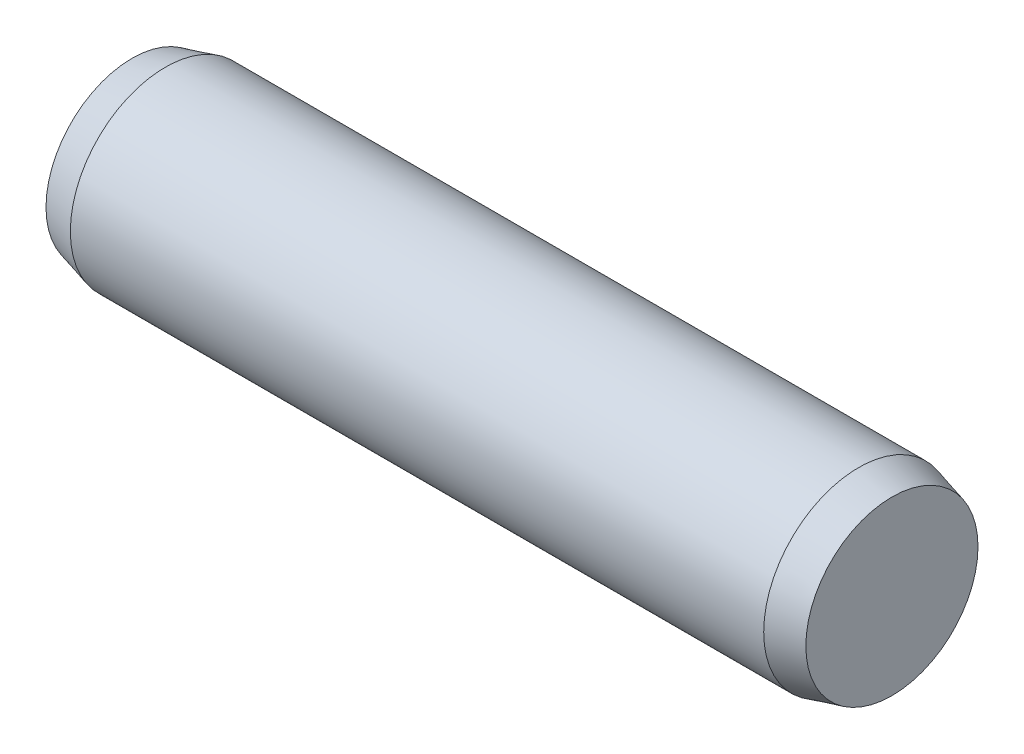
ISO-10303-21;
HEADER;
FILE_DESCRIPTION(('STEP AP214'),'2;1');
FILE_NAME('part.step','',(''),(''),'','','');
FILE_SCHEMA(('AUTOMOTIVE_DESIGN { 1 0 10303 214 1 1 1 1 }'));
ENDSEC;
DATA;
#1=APPLICATION_CONTEXT('core data for automotive mechanical design processes');
#2=APPLICATION_PROTOCOL_DEFINITION('international standard','automotive_design',2000,#1);
#3=PRODUCT_CONTEXT('',#1,'mechanical');
#4=PRODUCT('Part','Part','',(#3));
#5=PRODUCT_RELATED_PRODUCT_CATEGORY('part','',(#4));
#6=PRODUCT_DEFINITION_FORMATION('','',#4);
#7=PRODUCT_DEFINITION_CONTEXT('part definition',#1,'design');
#8=PRODUCT_DEFINITION('design','',#6,#7);
#9=PRODUCT_DEFINITION_SHAPE('','',#8);
#10=(LENGTH_UNIT() NAMED_UNIT(*) SI_UNIT(.MILLI.,.METRE.));
#11=(NAMED_UNIT(*) PLANE_ANGLE_UNIT() SI_UNIT($,.RADIAN.));
#12=(NAMED_UNIT(*) SI_UNIT($,.STERADIAN.) SOLID_ANGLE_UNIT());
#13=UNCERTAINTY_MEASURE_WITH_UNIT(LENGTH_MEASURE(1.E-05),#10,'distance_accuracy_value','');
#14=(GEOMETRIC_REPRESENTATION_CONTEXT(3) GLOBAL_UNCERTAINTY_ASSIGNED_CONTEXT((#13)) GLOBAL_UNIT_ASSIGNED_CONTEXT((#10,
#11,#12)) REPRESENTATION_CONTEXT('',''));
#15=CARTESIAN_POINT('',(0.,0.,0.));
#16=DIRECTION('',(0.,0.,1.));
#17=DIRECTION('',(1.,0.,0.));
#18=AXIS2_PLACEMENT_3D('',#15,#16,#17);
#19=CARTESIAN_POINT('',(-3.65,0.,0.));
#20=DIRECTION('',(1.,0.,0.));
#21=DIRECTION('',(0.,0.,-0.999999999999999));
#22=AXIS2_PLACEMENT_3D('',#19,#20,#21);
#23=CYLINDRICAL_SURFACE('',#22,1.);
#24=CARTESIAN_POINT('',(-3.65,0.,0.));
#25=DIRECTION('',(-1.,0.,0.));
#26=DIRECTION('',(0.,0.,0.999999999999999));
#27=AXIS2_PLACEMENT_3D('',#24,#25,#26);
#28=CIRCLE('',#27,1.);
#29=CARTESIAN_POINT('',(-3.65,0.,0.999999999999972));
#30=VERTEX_POINT('',#29);
#31=EDGE_CURVE('E48',#30,#30,#28,.T.);
#32=ORIENTED_EDGE('',*,*,#31,.F.);
#33=EDGE_LOOP('',(#32));
#34=FACE_BOUND('',#33,.T.);
#35=CARTESIAN_POINT('',(3.65000000000001,0.,0.));
#36=DIRECTION('',(1.,0.,0.));
#37=DIRECTION('',(0.,0.,-0.999999999999999));
#38=AXIS2_PLACEMENT_3D('',#35,#36,#37);
#39=CIRCLE('',#38,1.);
#40=CARTESIAN_POINT('',(3.65000000000001,0.,-0.999999999999999));
#41=VERTEX_POINT('',#40);
#42=EDGE_CURVE('E10',#41,#41,#39,.T.);
#43=ORIENTED_EDGE('',*,*,#42,.F.);
#44=EDGE_LOOP('',(#43));
#45=FACE_BOUND('',#44,.T.);
#46=ADVANCED_FACE('F34',(#34,#45),#23,.T.);
#47=CARTESIAN_POINT('',(3.65000000000001,0.,0.));
#48=DIRECTION('',(-1.,0.,0.));
#49=DIRECTION('',(0.,0.,-0.999999999999999));
#50=AXIS2_PLACEMENT_3D('',#47,#48,#49);
#51=CONICAL_SURFACE('',#50,1.,0.26179938779915);
#52=CARTESIAN_POINT('',(4.00000000000001,0.,0.));
#53=DIRECTION('',(1.,0.,0.));
#54=DIRECTION('',(0.,0.,-0.999999999999999));
#55=AXIS2_PLACEMENT_3D('',#52,#53,#54);
#56=CIRCLE('',#55,0.906217782649107);
#57=CARTESIAN_POINT('',(4.00000000000001,0.,-0.906217782649106));
#58=VERTEX_POINT('',#57);
#59=EDGE_CURVE('E40',#58,#58,#56,.T.);
#60=ORIENTED_EDGE('',*,*,#59,.F.);
#61=EDGE_LOOP('',(#60));
#62=FACE_BOUND('',#61,.T.);
#63=ORIENTED_EDGE('',*,*,#42,.T.);
#64=EDGE_LOOP('',(#63));
#65=FACE_BOUND('',#64,.T.);
#66=ADVANCED_FACE('F58',(#62,#65),#51,.T.);
#67=CARTESIAN_POINT('',(4.00000000000001,0.,0.));
#68=DIRECTION('',(1.,0.,0.));
#69=DIRECTION('',(0.,0.,-0.999999999999999));
#70=AXIS2_PLACEMENT_3D('',#67,#68,#69);
#71=PLANE('',#70);
#72=ORIENTED_EDGE('',*,*,#59,.T.);
#73=EDGE_LOOP('',(#72));
#74=FACE_BOUND('',#73,.T.);
#75=ADVANCED_FACE('F62',(#74),#71,.T.);
#76=CARTESIAN_POINT('',(-3.65,0.,0.));
#77=DIRECTION('',(1.,0.,0.));
#78=DIRECTION('',(0.,0.,0.999999999999999));
#79=AXIS2_PLACEMENT_3D('',#76,#77,#78);
#80=CONICAL_SURFACE('',#79,1.,0.26179938779915);
#81=CARTESIAN_POINT('',(-3.99999999999999,0.,0.));
#82=DIRECTION('',(-1.,0.,0.));
#83=DIRECTION('',(0.,0.,0.999999999999999));
#84=AXIS2_PLACEMENT_3D('',#81,#82,#83);
#85=CIRCLE('',#84,0.906217782649107);
#86=CARTESIAN_POINT('',(-3.99999999999999,0.,0.906217782649078));
#87=VERTEX_POINT('',#86);
#88=EDGE_CURVE('E44',#87,#87,#85,.T.);
#89=ORIENTED_EDGE('',*,*,#88,.F.);
#90=EDGE_LOOP('',(#89));
#91=FACE_BOUND('',#90,.T.);
#92=ORIENTED_EDGE('',*,*,#31,.T.);
#93=EDGE_LOOP('',(#92));
#94=FACE_BOUND('',#93,.T.);
#95=ADVANCED_FACE('F54',(#91,#94),#80,.T.);
#96=CARTESIAN_POINT('',(-3.99999999999999,0.,0.));
#97=DIRECTION('',(-1.,0.,0.));
#98=DIRECTION('',(0.,0.,0.999999999999999));
#99=AXIS2_PLACEMENT_3D('',#96,#97,#98);
#100=PLANE('',#99);
#101=ORIENTED_EDGE('',*,*,#88,.T.);
#102=EDGE_LOOP('',(#101));
#103=FACE_BOUND('',#102,.T.);
#104=ADVANCED_FACE('F71',(#103),#100,.T.);
#105=CLOSED_SHELL('',(#46,#66,#75,#95,#104));
#106=MANIFOLD_SOLID_BREP('B2',#105);
#107=ADVANCED_BREP_SHAPE_REPRESENTATION('',(#18,#106),#14);
#108=SHAPE_DEFINITION_REPRESENTATION(#9,#107);
ENDSEC;
END-ISO-10303-21;
